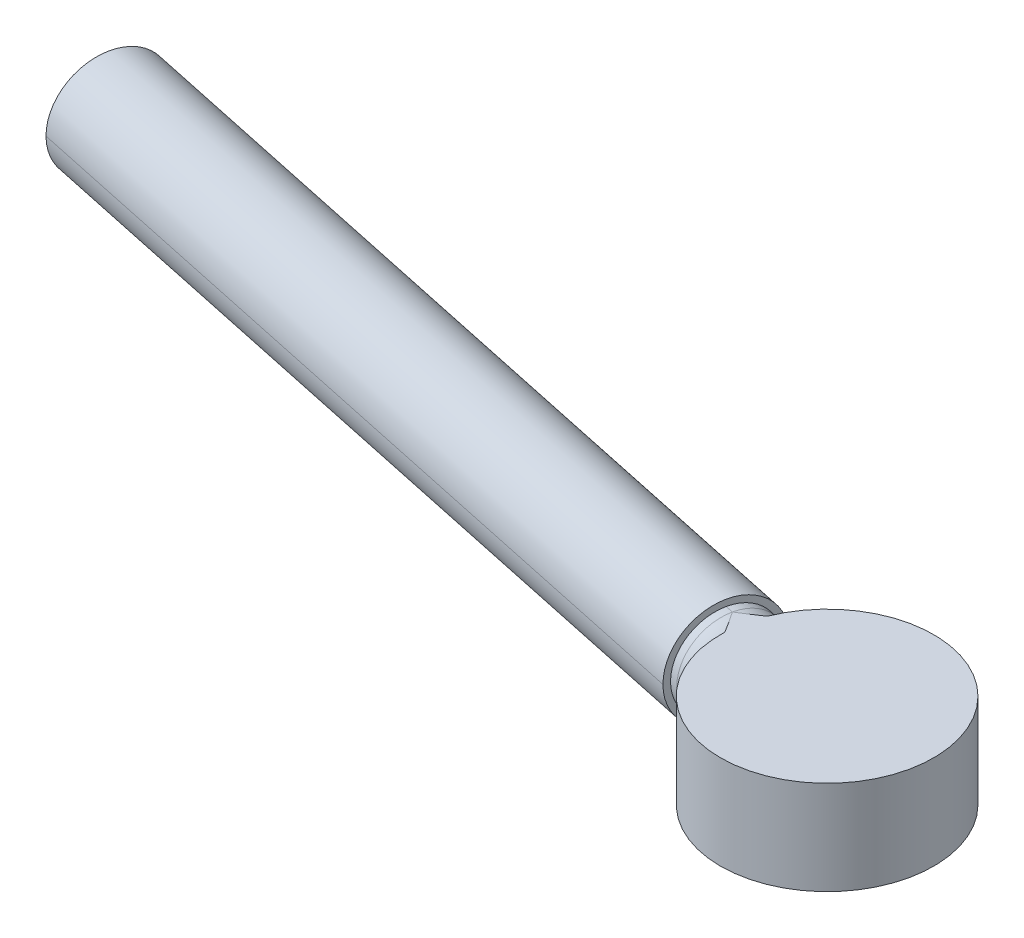
ISO-10303-21;
HEADER;
FILE_DESCRIPTION(('STEP AP214'),'2;1');
FILE_NAME('part.step','',(''),(''),'','','');
FILE_SCHEMA(('AUTOMOTIVE_DESIGN { 1 0 10303 214 1 1 1 1 }'));
ENDSEC;
DATA;
#1=APPLICATION_CONTEXT('core data for automotive mechanical design processes');
#2=APPLICATION_PROTOCOL_DEFINITION('international standard','automotive_design',2000,#1);
#3=PRODUCT_CONTEXT('',#1,'mechanical');
#4=PRODUCT('Part','Part','',(#3));
#5=PRODUCT_RELATED_PRODUCT_CATEGORY('part','',(#4));
#6=PRODUCT_DEFINITION_FORMATION('','',#4);
#7=PRODUCT_DEFINITION_CONTEXT('part definition',#1,'design');
#8=PRODUCT_DEFINITION('design','',#6,#7);
#9=PRODUCT_DEFINITION_SHAPE('','',#8);
#10=(LENGTH_UNIT() NAMED_UNIT(*) SI_UNIT(.MILLI.,.METRE.));
#11=(NAMED_UNIT(*) PLANE_ANGLE_UNIT() SI_UNIT($,.RADIAN.));
#12=(NAMED_UNIT(*) SI_UNIT($,.STERADIAN.) SOLID_ANGLE_UNIT());
#13=UNCERTAINTY_MEASURE_WITH_UNIT(LENGTH_MEASURE(1.E-05),#10,'distance_accuracy_value','');
#14=(GEOMETRIC_REPRESENTATION_CONTEXT(3) GLOBAL_UNCERTAINTY_ASSIGNED_CONTEXT((#13)) GLOBAL_UNIT_ASSIGNED_CONTEXT((#10,
#11,#12)) REPRESENTATION_CONTEXT('',''));
#15=CARTESIAN_POINT('',(0.,0.,0.));
#16=DIRECTION('',(0.,0.,1.));
#17=DIRECTION('',(1.,0.,0.));
#18=AXIS2_PLACEMENT_3D('',#15,#16,#17);
#19=CARTESIAN_POINT('',(-457.741621396042,-209.999999999997,614.766894941122));
#20=DIRECTION('',(-0.978172732854997,0.,-0.207793418324517));
#21=DIRECTION('',(-0.207793418324517,0.,0.978172732854997));
#22=AXIS2_PLACEMENT_3D('',#19,#20,#21);
#23=PLANE('',#22);
#24=CARTESIAN_POINT('',(-457.741621396042,-209.999999999997,614.766894941122));
#25=DIRECTION('',(-0.978172732854997,0.,-0.207793418324517));
#26=DIRECTION('',(-0.207793418324516,0.,0.978172732854997));
#27=AXIS2_PLACEMENT_3D('',#24,#25,#26);
#28=CIRCLE('',#27,37.5);
#29=CARTESIAN_POINT('',(-465.533874583212,-209.999999999997,651.448372423185));
#30=VERTEX_POINT('',#29);
#31=CARTESIAN_POINT('',(-449.949368208873,-209.999999999997,578.08541745906));
#32=VERTEX_POINT('',#31);
#33=EDGE_CURVE('E11',#30,#32,#28,.T.);
#34=ORIENTED_EDGE('',*,*,#33,.T.);
#35=CARTESIAN_POINT('',(-457.741621396042,-209.999999999997,614.766894941122));
#36=DIRECTION('',(-0.978172732854997,0.,-0.207793418324517));
#37=DIRECTION('',(-0.207793418324516,0.,0.978172732854997));
#38=AXIS2_PLACEMENT_3D('',#35,#36,#37);
#39=CIRCLE('',#38,37.5);
#40=EDGE_CURVE('E33',#32,#30,#39,.T.);
#41=ORIENTED_EDGE('',*,*,#40,.T.);
#42=EDGE_LOOP('',(#34,#41));
#43=FACE_BOUND('',#42,.T.);
#44=ADVANCED_FACE('F17',(#43),#23,.T.);
#45=CARTESIAN_POINT('',(-457.741621396042,-209.999999999997,614.766894941122));
#46=DIRECTION('',(0.978172732854997,0.,0.207793418324516));
#47=DIRECTION('',(0.207793418324516,0.,-0.978172732854997));
#48=AXIS2_PLACEMENT_3D('',#45,#46,#47);
#49=CYLINDRICAL_SURFACE('',#48,37.5);
#50=DIRECTION('',(0.978172732854997,0.,0.207793418324517));
#51=VECTOR('',#50,1.);
#52=CARTESIAN_POINT('',(-553.700254094905,-209.999999999996,556.04559718158));
#53=LINE('',#52,#51);
#54=CARTESIAN_POINT('',(100.76188038849,-210.000000000001,695.073111975763));
#55=VERTEX_POINT('',#54);
#56=EDGE_CURVE('E42',#32,#55,#53,.T.);
#57=ORIENTED_EDGE('',*,*,#56,.F.);
#58=ORIENTED_EDGE('',*,*,#33,.F.);
#59=DIRECTION('',(0.978172732854997,0.,0.207793418324517));
#60=VECTOR('',#59,1.);
#61=CARTESIAN_POINT('',(-569.284760469243,-209.999999999996,629.408552145705));
#62=LINE('',#61,#60);
#63=CARTESIAN_POINT('',(85.1773740141513,-210.000000000001,768.436066939888));
#64=VERTEX_POINT('',#63);
#65=EDGE_CURVE('E211',#30,#64,#62,.T.);
#66=ORIENTED_EDGE('',*,*,#65,.T.);
#67=CARTESIAN_POINT('',(92.9696272013206,-210.000000000001,731.754589457825));
#68=DIRECTION('',(0.978172732854997,0.,0.207793418324517));
#69=DIRECTION('',(-0.207793418324516,0.,0.978172732854997));
#70=AXIS2_PLACEMENT_3D('',#67,#68,#69);
#71=CIRCLE('',#70,37.5);
#72=EDGE_CURVE('E119',#55,#64,#71,.T.);
#73=ORIENTED_EDGE('',*,*,#72,.F.);
#74=EDGE_LOOP('',(#57,#58,#66,#73));
#75=FACE_BOUND('',#74,.T.);
#76=ADVANCED_FACE('F192',(#75),#49,.T.);
#77=CARTESIAN_POINT('',(-457.741621396042,-209.999999999997,614.766894941122));
#78=DIRECTION('',(0.978172732854997,0.,0.207793418324517));
#79=DIRECTION('',(0.207793418324517,0.,-0.978172732854997));
#80=AXIS2_PLACEMENT_3D('',#77,#78,#79);
#81=CYLINDRICAL_SURFACE('',#80,37.5);
#82=ORIENTED_EDGE('',*,*,#40,.F.);
#83=ORIENTED_EDGE('',*,*,#56,.T.);
#84=CARTESIAN_POINT('',(92.9696272013206,-210.000000000001,731.754589457825));
#85=DIRECTION('',(0.978172732854997,0.,0.207793418324517));
#86=DIRECTION('',(-0.207793418324516,0.,0.978172732854997));
#87=AXIS2_PLACEMENT_3D('',#84,#85,#86);
#88=CIRCLE('',#87,37.5);
#89=EDGE_CURVE('E130',#64,#55,#88,.T.);
#90=ORIENTED_EDGE('',*,*,#89,.F.);
#91=ORIENTED_EDGE('',*,*,#65,.F.);
#92=EDGE_LOOP('',(#82,#83,#90,#91));
#93=FACE_BOUND('',#92,.T.);
#94=ADVANCED_FACE('F189',(#93),#81,.T.);
#95=CARTESIAN_POINT('',(92.9696272013206,-210.000000000001,731.754589457825));
#96=DIRECTION('',(0.978172732854997,0.,0.207793418324517));
#97=DIRECTION('',(0.207793418324517,0.,-0.978172732854997));
#98=AXIS2_PLACEMENT_3D('',#95,#96,#97);
#99=PLANE('',#98);
#100=ORIENTED_EDGE('',*,*,#89,.T.);
#101=ORIENTED_EDGE('',*,*,#72,.T.);
#102=EDGE_LOOP('',(#100,#101));
#103=FACE_BOUND('',#102,.T.);
#104=CARTESIAN_POINT('',(92.9696272013206,-210.000000000001,731.754589457825));
#105=DIRECTION('',(0.978172732854997,0.,0.207793418324517));
#106=DIRECTION('',(-0.207793418324517,0.,0.978172732854997));
#107=AXIS2_PLACEMENT_3D('',#104,#105,#106);
#108=CIRCLE('',#107,33.);
#109=CARTESIAN_POINT('',(92.9696272013209,-177.000000000001,731.754589457825));
#110=VERTEX_POINT('',#109);
#111=CARTESIAN_POINT('',(92.9696272013204,-243.000000000001,731.754589457825));
#112=VERTEX_POINT('',#111);
#113=EDGE_CURVE('E115',#110,#112,#108,.T.);
#114=ORIENTED_EDGE('',*,*,#113,.F.);
#115=CARTESIAN_POINT('',(92.9696272013206,-210.000000000001,731.754589457825));
#116=DIRECTION('',(0.978172732854997,0.,0.207793418324517));
#117=DIRECTION('',(-0.207793418324517,0.,0.978172732854997));
#118=AXIS2_PLACEMENT_3D('',#115,#116,#117);
#119=CIRCLE('',#118,33.);
#120=EDGE_CURVE('E111',#112,#110,#119,.T.);
#121=ORIENTED_EDGE('',*,*,#120,.F.);
#122=EDGE_LOOP('',(#114,#121));
#123=FACE_BOUND('',#122,.T.);
#124=ADVANCED_FACE('F188',(#103,#123),#99,.T.);
#125=CARTESIAN_POINT('',(98.4827404983592,-210.000000000001,732.92574115642));
#126=DIRECTION('',(-0.978172732854997,0.,-0.207793418324517));
#127=DIRECTION('',(-0.207793418324517,0.,0.978172732854997));
#128=AXIS2_PLACEMENT_3D('',#125,#126,#127);
#129=CYLINDRICAL_SURFACE('',#128,33.);
#130=DIRECTION('',(-0.978172732854997,0.,-0.207793418324517));
#131=VECTOR('',#130,1.);
#132=CARTESIAN_POINT('',(40.2461169004362,-243.,720.554524210134));
#133=LINE('',#132,#131);
#134=CARTESIAN_POINT('',(98.482740498359,-243.000000000001,732.92574115642));
#135=VERTEX_POINT('',#134);
#136=EDGE_CURVE('E118',#135,#112,#133,.T.);
#137=ORIENTED_EDGE('',*,*,#136,.F.);
#138=CARTESIAN_POINT('',(98.4827404983592,-210.000000000001,732.92574115642));
#139=DIRECTION('',(-0.978172732854997,0.,-0.207793418324517));
#140=DIRECTION('',(0.,1.,0.));
#141=AXIS2_PLACEMENT_3D('',#138,#139,#140);
#142=CIRCLE('',#141,33.);
#143=CARTESIAN_POINT('',(98.4827404983594,-177.000000000001,732.92574115642));
#144=VERTEX_POINT('',#143);
#145=EDGE_CURVE('E88',#135,#144,#142,.T.);
#146=ORIENTED_EDGE('',*,*,#145,.T.);
#147=DIRECTION('',(-0.978172732854997,0.,-0.207793418324517));
#148=VECTOR('',#147,1.);
#149=CARTESIAN_POINT('',(40.2461169004367,-177.,720.554524210134));
#150=LINE('',#149,#148);
#151=EDGE_CURVE('E105',#144,#110,#150,.T.);
#152=ORIENTED_EDGE('',*,*,#151,.T.);
#153=ORIENTED_EDGE('',*,*,#113,.T.);
#154=EDGE_LOOP('',(#137,#146,#152,#153));
#155=FACE_BOUND('',#154,.T.);
#156=ADVANCED_FACE('F117',(#155),#129,.T.);
#157=CARTESIAN_POINT('',(98.4827404983588,-210.000000000001,732.92574115642));
#158=DIRECTION('',(-0.978172732854997,0.,-0.207793418324517));
#159=DIRECTION('',(-0.207793418324517,0.,0.978172732854996));
#160=AXIS2_PLACEMENT_3D('',#157,#158,#159);
#161=TOROIDAL_SURFACE('',#160,67.9999999999995,35.0000000000001);
#162=CARTESIAN_POINT('',(111.098486219041,-244.53681765066,729.758596144085));
#163=CARTESIAN_POINT('',(110.941768482228,-244.613444461883,730.292168893162));
#164=CARTESIAN_POINT('',(110.79058248544,-244.679027402962,730.828962060624));
#165=CARTESIAN_POINT('',(110.499691243941,-244.787855427397,731.907907797668));
#166=CARTESIAN_POINT('',(110.359986243354,-244.83110003587,732.450060480937));
#167=CARTESIAN_POINT('',(110.092514208173,-244.894990057772,733.538485760171));
#168=CARTESIAN_POINT('',(109.96474421512,-244.915641085385,734.084757298673));
#169=CARTESIAN_POINT('',(109.721427341549,-244.934259123897,735.180392490197));
#170=CARTESIAN_POINT('',(109.605880288248,-244.932226455496,735.729756099393));
#171=CARTESIAN_POINT('',(109.388052512653,-244.905585102191,736.82636816393));
#172=CARTESIAN_POINT('',(109.285680653782,-244.881142209116,737.373602553956));
#173=CARTESIAN_POINT('',(109.093367300513,-244.810043356885,738.468812101079));
#174=CARTESIAN_POINT('',(109.003425902184,-244.763387226069,739.01678726387));
#175=CARTESIAN_POINT('',(108.836042866999,-244.648103607215,740.112300932209));
#176=CARTESIAN_POINT('',(108.758600354637,-244.579477659099,740.659839465667));
#177=CARTESIAN_POINT('',(108.616185136333,-244.420615374932,741.7533541947));
#178=CARTESIAN_POINT('',(108.551212245277,-244.330379359731,742.299330413349));
#179=CARTESIAN_POINT('',(108.383713735683,-244.043074186214,743.851282871529));
#180=CARTESIAN_POINT('',(108.296136764008,-243.820344871625,744.854269272875));
#181=CARTESIAN_POINT('',(108.161979012155,-243.30596798824,746.844924480909));
#182=CARTESIAN_POINT('',(108.115396211869,-243.014323816322,747.832594040023));
#183=CARTESIAN_POINT('',(108.061066539994,-242.365895950872,749.788726643695));
#184=CARTESIAN_POINT('',(108.053368078203,-242.009031632416,750.757164252538));
#185=CARTESIAN_POINT('',(108.074287270806,-241.235006181544,752.669203504181));
#186=CARTESIAN_POINT('',(108.102909696819,-240.817837133035,753.612801867126));
#187=CARTESIAN_POINT('',(108.211394138924,-239.751974718122,755.839135823845));
#188=CARTESIAN_POINT('',(108.307033271847,-239.076929330196,757.10855893824));
#189=CARTESIAN_POINT('',(108.554477289827,-237.630940312896,759.585890025371));
#190=CARTESIAN_POINT('',(108.706302896396,-236.859961373044,760.793775115739));
#191=CARTESIAN_POINT('',(109.057483695777,-235.232479976029,763.145590693423));
#192=CARTESIAN_POINT('',(109.256908650551,-234.375853073547,764.289424239672));
#193=CARTESIAN_POINT('',(109.69451192845,-232.588287897537,766.509095079622));
#194=CARTESIAN_POINT('',(109.932685373146,-231.657358986126,767.584940909322));
#195=CARTESIAN_POINT('',(110.418630924416,-229.809779561145,769.581786271557));
#196=CARTESIAN_POINT('',(110.663970443603,-228.898343187018,770.508228892788));
#197=CARTESIAN_POINT('',(111.174537513722,-227.02598695578,772.303736472869));
#198=CARTESIAN_POINT('',(111.439765016493,-226.0650672185,773.172801570656));
#199=CARTESIAN_POINT('',(111.984261523108,-224.099948141472,774.853012971645));
#200=CARTESIAN_POINT('',(112.263512450766,-223.095804744067,775.664230731929));
#201=CARTESIAN_POINT('',(112.831197315355,-221.047461628506,777.230593998109));
#202=CARTESIAN_POINT('',(113.119630173633,-220.003266612505,777.985746055877));
#203=CARTESIAN_POINT('',(113.704727512924,-217.864301524127,779.450522854152));
#204=CARTESIAN_POINT('',(114.001450417279,-216.769044950537,780.15941262997));
#205=CARTESIAN_POINT('',(114.594537432557,-214.544756467993,781.521151865999));
#206=CARTESIAN_POINT('',(114.890901637346,-213.415737648858,782.174022674768));
#207=CARTESIAN_POINT('',(115.373606422916,-211.53629388386,783.200856459522));
#208=CARTESIAN_POINT('',(115.561354036157,-210.795024340287,783.590997221428));
#209=CARTESIAN_POINT('',(115.751498340887,-210.031801232928,783.977935428958));
#210=CARTESIAN_POINT('',(115.755457982996,-210.015901985013,783.985989531319));
#211=CARTESIAN_POINT('',(115.759416912056,-210.000000000001,783.994038538954));
#212=B_SPLINE_CURVE_WITH_KNOTS('',3,(#162,#163,#164,#165,#166,#167,#168,#169,#170,#171,#172,
#173,#174,#175,#176,#177,#178,#179,#180,#181,#182,#183,#184,#185,#186,#187,#188,#189,#190,#191,
#192,#193,#194,#195,#196,#197,#198,#199,#200,#201,#202,#203,#204,#205,#206,#207,#208,#209,#210,
#211),.UNSPECIFIED.,.F.,.F.,(4,2,2,2,2,2,2,2,2,2,2,2,2,2,2,2,2,2,2,2,2,2,2,2,4),(0.,
1.68396774470165,3.36797128691024,5.05155628309766,6.73511747689134,8.40632324128226,
10.0775419207681,11.7486434858697,13.419720241189,16.509504136016,19.5991357642092,
22.6926129416733,25.7864965635558,30.102820114442,34.4207371099561,38.7450217618062,
43.0687624075774,47.0340620687119,50.9993521277479,54.9596559443975,58.9194962266286,
62.9317531099527,66.9424740867513,69.5174274974929,69.5721997560343),.UNSPECIFIED.);
#213=CARTESIAN_POINT('',(115.759416912056,-210.000000000001,783.994038538953));
#214=VERTEX_POINT('',#213);
#215=CARTESIAN_POINT('',(108.121452309174,-242.999999999997,747.840543609041));
#216=VERTEX_POINT('',#215);
#217=EDGE_CURVE('E22',#214,#216,#212,.F.);
#218=ORIENTED_EDGE('',*,*,#217,.F.);
#219=CARTESIAN_POINT('',(108.121452309175,-176.999999999999,747.840543609007));
#220=CARTESIAN_POINT('',(108.099957119108,-177.162193167581,748.36819737181));
#221=CARTESIAN_POINT('',(108.084168224984,-177.333903855062,748.893127630386));
#222=CARTESIAN_POINT('',(108.063609372287,-177.695642109633,749.936790360937));
#223=CARTESIAN_POINT('',(108.058838090309,-177.885667473959,750.455523569837));
#224=CARTESIAN_POINT('',(108.059915259461,-178.283145211379,751.485621664816));
#225=CARTESIAN_POINT('',(108.065752446395,-178.49057887709,751.996993785937));
#226=CARTESIAN_POINT('',(108.087583411666,-178.922318960862,753.01232849104));
#227=CARTESIAN_POINT('',(108.103577521158,-179.146625928848,753.516290832886));
#228=CARTESIAN_POINT('',(108.165861872596,-179.840967692941,755.010199261138));
#229=CARTESIAN_POINT('',(108.226472717974,-180.334913464531,755.988584092364));
#230=CARTESIAN_POINT('',(108.382227768621,-181.381176821822,757.910946654624));
#231=CARTESIAN_POINT('',(108.477385805982,-181.93351772504,758.854910437248));
#232=CARTESIAN_POINT('',(108.751839268577,-183.371681510096,761.154415290653));
#233=CARTESIAN_POINT('',(108.949563746047,-184.289467596265,762.487898567518));
#234=CARTESIAN_POINT('',(109.399782329651,-186.226214593933,765.069417665477));
#235=CARTESIAN_POINT('',(109.652297923427,-187.245215113829,766.317419709718));
#236=CARTESIAN_POINT('',(110.200819234262,-189.373973049161,768.729711157034));
#237=CARTESIAN_POINT('',(110.496952522301,-190.48399230032,769.89373955153));
#238=CARTESIAN_POINT('',(111.120753966816,-192.780423550887,772.133638843837));
#239=CARTESIAN_POINT('',(111.448414078382,-193.966816036191,773.209532102625));
#240=CARTESIAN_POINT('',(112.20678861024,-196.702140307739,775.52441459536));
#241=CARTESIAN_POINT('',(112.643260459488,-198.269354819987,776.739911943348));
#242=CARTESIAN_POINT('',(113.529865413305,-201.490134903636,779.037815859209));
#243=CARTESIAN_POINT('',(113.97997245043,-203.143539584809,780.120458584668));
#244=CARTESIAN_POINT('',(114.613399113011,-205.530440670539,781.557696386853));
#245=CARTESIAN_POINT('',(114.797702344144,-206.232152114933,781.965514637636));
#246=CARTESIAN_POINT('',(115.164875059881,-207.647975684323,782.759802654641));
#247=CARTESIAN_POINT('',(115.347744567356,-208.362087610915,783.146272762014));
#248=CARTESIAN_POINT('',(115.602294852874,-209.371178391427,783.673084917718));
#249=CARTESIAN_POINT('',(115.675034292326,-209.661278534147,783.822333261518));
#250=CARTESIAN_POINT('',(115.751498336639,-209.968198751684,783.977935421478));
#251=CARTESIAN_POINT('',(115.755457978645,-209.984097999237,783.985989523686));
#252=CARTESIAN_POINT('',(115.759416912056,-210.000000000001,783.994038538954));
#253=B_SPLINE_CURVE_WITH_KNOTS('',3,(#219,#220,#221,#222,#223,#224,#225,#226,#227,#228,#229,
#230,#231,#232,#233,#234,#235,#236,#237,#238,#239,#240,#241,#242,#243,#244,#245,#246,#247,#248,
#249,#250,#251,#252),.UNSPECIFIED.,.F.,.F.,(4,2,2,2,2,2,2,2,2,2,2,2,2,2,2,2,4),(0.,
1.65715034389154,3.31410162521174,4.96929456425296,6.62454147178926,9.91443625961444,
13.2056497190848,18.090675315886,22.9776201656601,27.8791528870755,32.7794381522669,
38.8649413409974,44.9394654520084,47.4360349940186,49.9325646284065,50.9353032718323,
50.9900755303734),.UNSPECIFIED.);
#254=CARTESIAN_POINT('',(108.121452309176,-177.,747.840543609007));
#255=VERTEX_POINT('',#254);
#256=EDGE_CURVE('E77',#255,#214,#253,.T.);
#257=ORIENTED_EDGE('',*,*,#256,.F.);
#258=CARTESIAN_POINT('',(98.4827404983594,-177.000000000001,732.92574115642));
#259=CARTESIAN_POINT('',(98.8945235997645,-177.000000000001,733.539704298722));
#260=CARTESIAN_POINT('',(99.307724996084,-177.000000000001,734.155781904424));
#261=CARTESIAN_POINT('',(100.131721920986,-177.000000000001,735.386479674834));
#262=CARTESIAN_POINT('',(101.366181369875,-177.000000000001,737.233429129469));
#263=CARTESIAN_POINT('',(102.591422979693,-177.000000000001,739.085796676218));
#264=CARTESIAN_POINT('',(105.01737759216,-177.000000000001,742.804949276035));
#265=CARTESIAN_POINT('',(106.601956764222,-177.000000000001,745.303618907095));
#266=CARTESIAN_POINT('',(108.121452309176,-177.000000000001,747.840543609006));
#267=B_SPLINE_CURVE_WITH_KNOTS('',3,(#258,#259,#260,#261,#262,#263,#264,#265,#266),
.UNSPECIFIED.,.F.,.F.,(4,2,1,2,4),(-3.74165738677403E-05,0.00218038516758085,
0.00439818690902944,0.00883379039192659,0.0177049973577209),.UNSPECIFIED.);
#268=EDGE_CURVE('E83',#144,#255,#267,.T.);
#269=ORIENTED_EDGE('',*,*,#268,.F.);
#270=ORIENTED_EDGE('',*,*,#145,.F.);
#271=CARTESIAN_POINT('',(98.482740498359,-243.000000000001,732.92574115642));
#272=CARTESIAN_POINT('',(98.8945235999743,-243.000000000001,733.539704298588));
#273=CARTESIAN_POINT('',(99.3077249960828,-243.000000000001,734.155781904422));
#274=CARTESIAN_POINT('',(100.131721920983,-243.000000000001,735.386479674831));
#275=CARTESIAN_POINT('',(101.366181369872,-243.000000000001,737.233429129464));
#276=CARTESIAN_POINT('',(102.591422979689,-243.000000000001,739.085796676214));
#277=CARTESIAN_POINT('',(105.017377592158,-243.000000000001,742.804949276034));
#278=CARTESIAN_POINT('',(106.601956764226,-243.000000000001,745.303618907102));
#279=CARTESIAN_POINT('',(108.121452309175,-243.000000000001,747.840543609042));
#280=B_SPLINE_CURVE_WITH_KNOTS('',3,(#271,#272,#273,#274,#275,#276,#277,#278,#279),
.UNSPECIFIED.,.F.,.F.,(4,2,1,2,4),(-3.74165738677329E-05,0.00218038516760014,
0.00439818690906802,0.00883379039200377,0.0177049973578753),.UNSPECIFIED.);
#281=EDGE_CURVE('E125',#135,#216,#280,.T.);
#282=ORIENTED_EDGE('',*,*,#281,.T.);
#283=EDGE_LOOP('',(#218,#257,#269,#270,#282));
#284=FACE_BOUND('',#283,.T.);
#285=ADVANCED_FACE('F85',(#284),#161,.F.);
#286=CARTESIAN_POINT('',(270.182966472702,-243.000000000002,846.073627173712));
#287=DIRECTION('',(0.,-1.,0.));
#288=DIRECTION('',(1.,0.,0.));
#289=AXIS2_PLACEMENT_3D('',#286,#287,#288);
#290=PLANE('',#289);
#291=CARTESIAN_POINT('',(113.352191228242,-243.000000000001,723.217212299624));
#292=CARTESIAN_POINT('',(110.932596410941,-243.000000000001,724.917371212002));
#293=CARTESIAN_POINT('',(108.469088997503,-243.000000000001,726.556120215993));
#294=CARTESIAN_POINT('',(104.740709380339,-243.000000000001,728.967928904683));
#295=CARTESIAN_POINT('',(103.492399645811,-243.000000000001,729.764150502037));
#296=CARTESIAN_POINT('',(101.615788716063,-243.000000000001,730.952684433791));
#297=CARTESIAN_POINT('',(100.676447051014,-243.000000000001,731.545502317549));
#298=CARTESIAN_POINT('',(99.7363278172881,-243.000000000001,732.137232804402));
#299=CARTESIAN_POINT('',(99.1094952797962,-243.000000000001,732.531598994518));
#300=CARTESIAN_POINT('',(98.7945839071617,-243.000000000001,732.729634697872));
#301=CARTESIAN_POINT('',(98.482740498359,-243.000000000001,732.92574115642));
#302=B_SPLINE_CURVE_WITH_KNOTS('',3,(#291,#292,#293,#294,#295,#296,#297,#298,#299,#300,#301),
.UNSPECIFIED.,.F.,.F.,(4,2,2,1,2,4),(0.0811150065875,0.0899561340894636,0.0943766978404454,
0.0965869797159363,0.0976921206536818,0.0987972615914272),.UNSPECIFIED.);
#303=CARTESIAN_POINT('',(113.352191228242,-243.000000000001,723.217212299624));
#304=VERTEX_POINT('',#303);
#305=EDGE_CURVE('E93',#304,#135,#302,.T.);
#306=ORIENTED_EDGE('',*,*,#305,.F.);
#307=CARTESIAN_POINT('',(183.059335897266,-243.000000000001,750.892363285513));
#308=DIRECTION('',(0.,-1.,0.));
#309=DIRECTION('',(-0.978172732854997,0.,-0.207793418324516));
#310=AXIS2_PLACEMENT_3D('',#307,#308,#309);
#311=CIRCLE('',#310,75.);
#312=EDGE_CURVE('E122',#304,#216,#311,.T.);
#313=ORIENTED_EDGE('',*,*,#312,.T.);
#314=ORIENTED_EDGE('',*,*,#281,.F.);
#315=EDGE_LOOP('',(#306,#313,#314));
#316=FACE_BOUND('',#315,.T.);
#317=ADVANCED_FACE('F184',(#316),#290,.T.);
#318=CARTESIAN_POINT('',(98.4827404983592,-210.000000000001,732.92574115642));
#319=DIRECTION('',(-0.978172732854997,0.,-0.207793418324517));
#320=DIRECTION('',(-0.207793418324517,0.,0.978172732854997));
#321=AXIS2_PLACEMENT_3D('',#318,#319,#320);
#322=CYLINDRICAL_SURFACE('',#321,33.);
#323=CARTESIAN_POINT('',(98.4827404983592,-210.000000000001,732.92574115642));
#324=DIRECTION('',(-0.978172732854997,0.,-0.207793418324517));
#325=DIRECTION('',(0.,1.,0.));
#326=AXIS2_PLACEMENT_3D('',#323,#324,#325);
#327=CIRCLE('',#326,33.);
#328=EDGE_CURVE('E108',#144,#135,#327,.T.);
#329=ORIENTED_EDGE('',*,*,#328,.T.);
#330=ORIENTED_EDGE('',*,*,#136,.T.);
#331=ORIENTED_EDGE('',*,*,#120,.T.);
#332=ORIENTED_EDGE('',*,*,#151,.F.);
#333=EDGE_LOOP('',(#329,#330,#331,#332));
#334=FACE_BOUND('',#333,.T.);
#335=ADVANCED_FACE('F106',(#334),#322,.T.);
#336=CARTESIAN_POINT('',(183.059335897265,-177.000000000001,750.892363285513));
#337=DIRECTION('',(0.,-1.,0.));
#338=DIRECTION('',(1.,0.,0.));
#339=AXIS2_PLACEMENT_3D('',#336,#337,#338);
#340=CYLINDRICAL_SURFACE('',#339,75.);
#341=CARTESIAN_POINT('',(113.352191228241,-243.000000000004,723.217212299623));
#342=CARTESIAN_POINT('',(113.547051826248,-242.837806832421,722.726386583161));
#343=CARTESIAN_POINT('',(113.746018798852,-242.666096144941,722.240368878381));
#344=CARTESIAN_POINT('',(114.151500628473,-242.30435789037,721.278475408494));
#345=CARTESIAN_POINT('',(114.358014575942,-242.114332526043,720.802598432115));
#346=CARTESIAN_POINT('',(114.777749785096,-241.716854788623,719.86189359011));
#347=CARTESIAN_POINT('',(114.990963696475,-241.509421122913,719.397054535162));
#348=CARTESIAN_POINT('',(115.423658932641,-241.077681039141,718.478274916847));
#349=CARTESIAN_POINT('',(115.643140461553,-240.853374071155,718.024334709326));
#350=CARTESIAN_POINT('',(116.307343420486,-240.159032307062,716.684754117581));
#351=CARTESIAN_POINT('',(116.760448949033,-239.665086535472,715.81549815266));
#352=CARTESIAN_POINT('',(117.684224169139,-238.618823178181,714.122460409637));
#353=CARTESIAN_POINT('',(118.154900828053,-238.066482274963,713.298696998375));
#354=CARTESIAN_POINT('',(119.340438382101,-236.628318489906,711.30933831229));
#355=CARTESIAN_POINT('',(120.063170026585,-235.710532403737,710.171387703198));
#356=CARTESIAN_POINT('',(121.523937513395,-233.773785406069,707.995819736981));
#357=CARTESIAN_POINT('',(122.261979256951,-232.754784886174,706.958241974932));
#358=CARTESIAN_POINT('',(123.743766721247,-230.626026950841,704.97724940405));
#359=CARTESIAN_POINT('',(124.487522892332,-229.516007699682,704.034124923692));
#360=CARTESIAN_POINT('',(125.968009463728,-227.219576449116,702.241239931906));
#361=CARTESIAN_POINT('',(126.704741603945,-226.033183963812,701.391455720127));
#362=CARTESIAN_POINT('',(128.338661890064,-223.297859692264,699.584768867253));
#363=CARTESIAN_POINT('',(129.231560454441,-221.730645180015,698.651669927224));
#364=CARTESIAN_POINT('',(130.975735611088,-218.509865096367,696.912623126933));
#365=CARTESIAN_POINT('',(131.827084388769,-216.856460415194,696.106448905934));
#366=CARTESIAN_POINT('',(132.990070473936,-214.469559329463,695.050823402927));
#367=CARTESIAN_POINT('',(133.324242503127,-213.767847885068,694.753144949585));
#368=CARTESIAN_POINT('',(133.982598133504,-212.352024315679,694.176710112769));
#369=CARTESIAN_POINT('',(134.306781894269,-211.63791238909,693.8979534269));
#370=CARTESIAN_POINT('',(134.753507600453,-210.628821608574,693.520113462521));
#371=CARTESIAN_POINT('',(134.880637334343,-210.338721465853,693.413323364952));
#372=CARTESIAN_POINT('',(135.013752956443,-210.031801248318,693.302242253097));
#373=CARTESIAN_POINT('',(135.020644777867,-210.015902000765,693.296493329313));
#374=CARTESIAN_POINT('',(135.027533883966,-210.000000000001,693.290748765127));
#375=B_SPLINE_CURVE_WITH_KNOTS('',3,(#341,#342,#343,#344,#345,#346,#347,#348,#349,#350,#351,
#352,#353,#354,#355,#356,#357,#358,#359,#360,#361,#362,#363,#364,#365,#366,#367,#368,#369,#370,
#371,#372,#373,#374),.UNSPECIFIED.,.F.,.F.,(4,2,2,2,2,2,2,2,2,2,2,2,2,2,2,2,4),(0.,
1.65715034389151,3.3141016252115,4.96929456425282,6.624541471789,9.91443625961438,
13.2056497190851,18.0906753158865,22.9776201656609,27.8791528870759,32.7794381522671,
38.8649413409974,44.9394654520091,47.4360349940199,49.9325646284078,50.9353032718336,
50.9900755303746),.UNSPECIFIED.);
#376=CARTESIAN_POINT('',(135.027533883965,-210.000000000001,693.290748765126));
#377=VERTEX_POINT('',#376);
#378=EDGE_CURVE('E155',#304,#377,#375,.T.);
#379=ORIENTED_EDGE('',*,*,#378,.T.);
#380=CARTESIAN_POINT('',(109.143577856786,-175.17243471543,738.185644066873));
#381=CARTESIAN_POINT('',(109.238665209404,-175.132898143476,737.63242044592));
#382=CARTESIAN_POINT('',(109.340130243067,-175.104715131256,737.079480048682));
#383=CARTESIAN_POINT('',(109.555602563759,-175.071111297546,735.97536250167));
#384=CARTESIAN_POINT('',(109.669609672686,-175.065690152872,735.424185326971));
#385=CARTESIAN_POINT('',(109.909894577455,-175.077660952252,734.325055056021));
#386=CARTESIAN_POINT('',(110.036166097789,-175.095041285495,733.777100461471));
#387=CARTESIAN_POINT('',(110.300706229394,-175.152494657772,732.685296853649));
#388=CARTESIAN_POINT('',(110.438974785326,-175.192567592139,732.141447821453));
#389=CARTESIAN_POINT('',(110.725936175799,-175.294776007526,731.063397451595));
#390=CARTESIAN_POINT('',(110.874534567994,-175.356728479046,730.529153590797));
#391=CARTESIAN_POINT('',(111.182703172408,-175.502439217109,729.466780005613));
#392=CARTESIAN_POINT('',(111.342274614063,-175.586199930017,728.938650974111));
#393=CARTESIAN_POINT('',(111.671845308087,-175.775102333397,727.889571802521));
#394=CARTESIAN_POINT('',(111.841843576057,-175.880242007642,727.368620990406));
#395=CARTESIAN_POINT('',(112.19171449692,-176.111399229764,726.334711478897));
#396=CARTESIAN_POINT('',(112.371588088573,-176.23741876481,725.821753545287));
#397=CARTESIAN_POINT('',(112.899026546044,-176.626696020638,724.368015011344));
#398=CARTESIAN_POINT('',(113.258013538899,-176.914910345266,723.437913771657));
#399=CARTESIAN_POINT('',(114.003798590522,-177.557212879317,721.612585706196));
#400=CARTESIAN_POINT('',(114.390594737917,-177.911296564072,720.717356490116));
#401=CARTESIAN_POINT('',(115.188489410153,-178.681385869097,718.963094804162));
#402=CARTESIAN_POINT('',(115.599628275666,-179.097496114989,718.104126702652));
#403=CARTESIAN_POINT('',(116.441381818185,-179.98638324901,716.426004240894));
#404=CARTESIAN_POINT('',(116.871999186739,-180.45916798343,715.606855415534));
#405=CARTESIAN_POINT('',(117.95592189876,-181.69255101834,713.631859595417));
#406=CARTESIAN_POINT('',(118.618285026468,-182.483568144187,712.499860412036));
#407=CARTESIAN_POINT('',(119.964552013926,-184.16429719594,710.325314140392));
#408=CARTESIAN_POINT('',(120.64846514463,-185.054052026287,709.282806290467));
#409=CARTESIAN_POINT('',(122.027837670113,-186.92070129096,707.284659453651));
#410=CARTESIAN_POINT('',(122.723310253008,-187.897701740934,706.329129082228));
#411=CARTESIAN_POINT('',(124.115423095504,-189.926953228472,704.503432675019));
#412=CARTESIAN_POINT('',(124.812063094011,-190.979189190486,703.633249619922));
#413=CARTESIAN_POINT('',(126.039986255384,-192.902033074196,702.163630128268));
#414=CARTESIAN_POINT('',(126.572707657361,-193.759256883646,701.547739630869));
#415=CARTESIAN_POINT('',(127.630567641909,-195.509705072465,700.362345377302));
#416=CARTESIAN_POINT('',(128.155706153099,-196.402929790421,699.792842057558));
#417=CARTESIAN_POINT('',(129.194418847219,-198.220894762829,698.699081136585));
#418=CARTESIAN_POINT('',(129.70800877778,-199.145587158091,698.174758763992));
#419=CARTESIAN_POINT('',(130.721414853054,-201.02495218553,697.16851524931));
#420=CARTESIAN_POINT('',(131.221232126057,-201.979622348062,696.686590626755));
#421=CARTESIAN_POINT('',(132.167826675692,-203.844701380613,695.797499511226));
#422=CARTESIAN_POINT('',(132.615787028831,-204.7531352479,695.38743916524));
#423=CARTESIAN_POINT('',(133.495331356683,-206.591864211368,694.600644964417));
#424=CARTESIAN_POINT('',(133.926918503783,-207.522155015516,694.223904634642));
#425=CARTESIAN_POINT('',(134.571074947252,-208.956416502233,693.673716241314));
#426=CARTESIAN_POINT('',(134.790305539635,-209.453003558211,693.48870261019));
#427=CARTESIAN_POINT('',(135.013752959731,-209.968198758934,693.302242250609));
#428=CARTESIAN_POINT('',(135.020644781263,-209.984098006741,693.296493326753));
#429=CARTESIAN_POINT('',(135.027533883966,-210.000000000001,693.290748765127));
#430=B_SPLINE_CURVE_WITH_KNOTS('',3,(#380,#381,#382,#383,#384,#385,#386,#387,#388,#389,#390,
#391,#392,#393,#394,#395,#396,#397,#398,#399,#400,#401,#402,#403,#404,#405,#406,#407,#408,#409,
#410,#411,#412,#413,#414,#415,#416,#417,#418,#419,#420,#421,#422,#423,#424,#425,#426,#427,#428,
#429),.UNSPECIFIED.,.F.,.F.,(4,2,2,2,2,2,2,2,2,2,2,2,2,2,2,2,2,2,2,2,2,2,2,2,4),(0.,
1.68803190557013,3.37603984360544,5.06318855948066,6.75032949361209,8.4236802724645,
10.0972188422868,11.7705996557085,13.4441398190635,16.554058338708,19.6637633121041,
22.7787743301935,25.8942171046103,30.4821167657387,35.0720178688894,39.6675742785028,
44.262212406081,47.8077974964478,51.3534159408411,54.8938637562291,58.4340206616898,
61.7113845580466,64.9881101722957,66.708471193444,66.7632434519856),.UNSPECIFIED.);
#431=CARTESIAN_POINT('',(113.352191228242,-177.000000000001,723.217212299624));
#432=VERTEX_POINT('',#431);
#433=EDGE_CURVE('E165',#377,#432,#430,.F.);
#434=ORIENTED_EDGE('',*,*,#433,.T.);
#435=CARTESIAN_POINT('',(183.059335897266,-177.000000000001,750.892363285513));
#436=DIRECTION('',(0.,1.,0.));
#437=DIRECTION('',(-0.978172732854997,0.,-0.207793418324516));
#438=AXIS2_PLACEMENT_3D('',#435,#436,#437);
#439=CIRCLE('',#438,75.);
#440=EDGE_CURVE('E97',#255,#432,#439,.T.);
#441=ORIENTED_EDGE('',*,*,#440,.F.);
#442=ORIENTED_EDGE('',*,*,#256,.T.);
#443=ORIENTED_EDGE('',*,*,#217,.T.);
#444=ORIENTED_EDGE('',*,*,#312,.F.);
#445=EDGE_LOOP('',(#379,#434,#441,#442,#443,#444));
#446=FACE_BOUND('',#445,.T.);
#447=ADVANCED_FACE('F170',(#446),#340,.T.);
#448=CARTESIAN_POINT('',(270.182966472702,-177.000000000002,846.073627173712));
#449=DIRECTION('',(0.,1.,0.));
#450=DIRECTION('',(0.,0.,1.));
#451=AXIS2_PLACEMENT_3D('',#448,#449,#450);
#452=PLANE('',#451);
#453=ORIENTED_EDGE('',*,*,#440,.T.);
#454=CARTESIAN_POINT('',(113.352191228242,-177.000000000001,723.217212299624));
#455=CARTESIAN_POINT('',(110.932596410956,-177.000000000001,724.917371211992));
#456=CARTESIAN_POINT('',(108.469088997522,-177.000000000001,726.556120215982));
#457=CARTESIAN_POINT('',(104.740709380355,-177.000000000001,728.967928904673));
#458=CARTESIAN_POINT('',(103.492399645825,-177.000000000001,729.764150502028));
#459=CARTESIAN_POINT('',(101.615788716073,-177.000000000001,730.952684433785));
#460=CARTESIAN_POINT('',(100.676447051022,-177.000000000001,731.545502317545));
#461=CARTESIAN_POINT('',(99.7363278172929,-177.000000000001,732.137232804398));
#462=CARTESIAN_POINT('',(99.1094952797989,-177.000000000001,732.531598994515));
#463=CARTESIAN_POINT('',(98.794583907103,-177.000000000001,732.729634697763));
#464=CARTESIAN_POINT('',(98.4827404983594,-177.000000000001,732.92574115642));
#465=B_SPLINE_CURVE_WITH_KNOTS('',3,(#454,#455,#456,#457,#458,#459,#460,#461,#462,#463,#464),
.UNSPECIFIED.,.F.,.F.,(4,2,2,1,2,4),(0.0811150066000749,0.0899561341022315,0.0943766978533098,
0.096586979728849,0.0976921206666186,0.0987972616043882),.UNSPECIFIED.);
#466=EDGE_CURVE('E92',#432,#144,#465,.T.);
#467=ORIENTED_EDGE('',*,*,#466,.T.);
#468=ORIENTED_EDGE('',*,*,#268,.T.);
#469=EDGE_LOOP('',(#453,#467,#468));
#470=FACE_BOUND('',#469,.T.);
#471=ADVANCED_FACE('F96',(#470),#452,.T.);
#472=CARTESIAN_POINT('',(98.4827404983592,-210.000000000001,732.92574115642));
#473=DIRECTION('',(-0.978172732854997,0.,-0.207793418324515));
#474=DIRECTION('',(-0.207793418324515,0.,0.978172732854997));
#475=AXIS2_PLACEMENT_3D('',#472,#473,#474);
#476=TOROIDAL_SURFACE('',#475,67.9999999999999,35.);
#477=ORIENTED_EDGE('',*,*,#433,.F.);
#478=ORIENTED_EDGE('',*,*,#378,.F.);
#479=ORIENTED_EDGE('',*,*,#305,.T.);
#480=ORIENTED_EDGE('',*,*,#328,.F.);
#481=ORIENTED_EDGE('',*,*,#466,.F.);
#482=EDGE_LOOP('',(#477,#478,#479,#480,#481));
#483=FACE_BOUND('',#482,.T.);
#484=ADVANCED_FACE('F19',(#483),#476,.F.);
#485=CLOSED_SHELL('',(#44,#76,#94,#124,#156,#285,#317,#335,#447,#471,#484));
#486=MANIFOLD_SOLID_BREP('B1',#485);
#487=ADVANCED_BREP_SHAPE_REPRESENTATION('',(#18,#486),#14);
#488=SHAPE_DEFINITION_REPRESENTATION(#9,#487);
ENDSEC;
END-ISO-10303-21;
